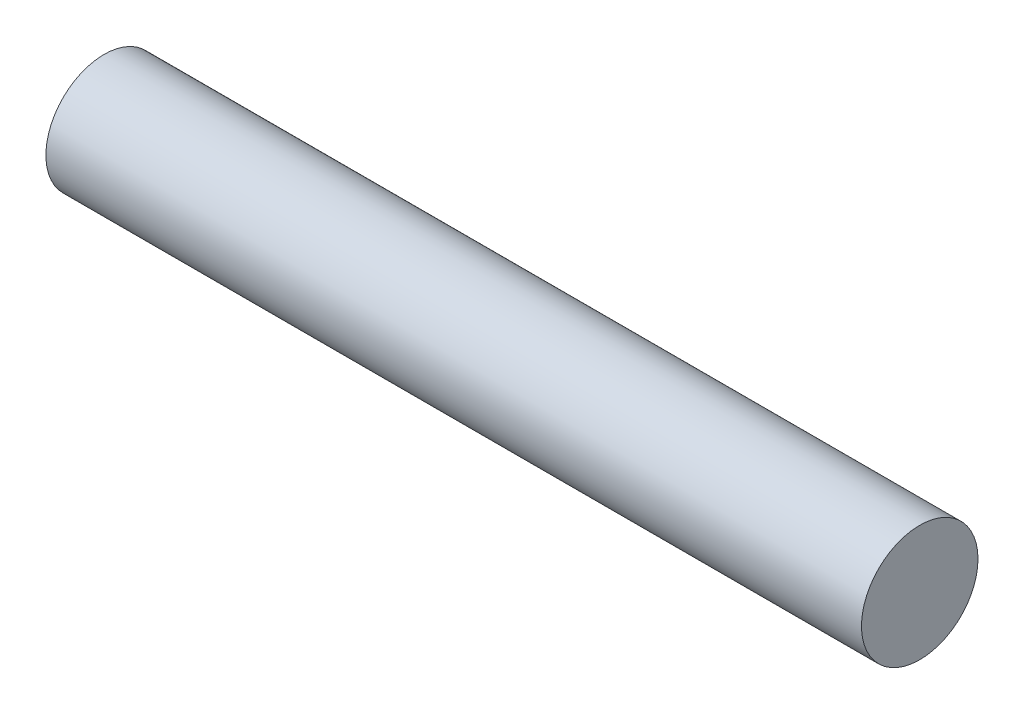
ISO-10303-21;
HEADER;
FILE_DESCRIPTION(('STEP AP214'),'2;1');
FILE_NAME('part.step','',(''),(''),'','','');
FILE_SCHEMA(('AUTOMOTIVE_DESIGN { 1 0 10303 214 1 1 1 1 }'));
ENDSEC;
DATA;
#1=APPLICATION_CONTEXT('core data for automotive mechanical design processes');
#2=APPLICATION_PROTOCOL_DEFINITION('international standard','automotive_design',2000,#1);
#3=PRODUCT_CONTEXT('',#1,'mechanical');
#4=PRODUCT('Part','Part','',(#3));
#5=PRODUCT_RELATED_PRODUCT_CATEGORY('part','',(#4));
#6=PRODUCT_DEFINITION_FORMATION('','',#4);
#7=PRODUCT_DEFINITION_CONTEXT('part definition',#1,'design');
#8=PRODUCT_DEFINITION('design','',#6,#7);
#9=PRODUCT_DEFINITION_SHAPE('','',#8);
#10=(LENGTH_UNIT() NAMED_UNIT(*) SI_UNIT(.MILLI.,.METRE.));
#11=(NAMED_UNIT(*) PLANE_ANGLE_UNIT() SI_UNIT($,.RADIAN.));
#12=(NAMED_UNIT(*) SI_UNIT($,.STERADIAN.) SOLID_ANGLE_UNIT());
#13=UNCERTAINTY_MEASURE_WITH_UNIT(LENGTH_MEASURE(1.E-05),#10,'distance_accuracy_value','');
#14=(GEOMETRIC_REPRESENTATION_CONTEXT(3) GLOBAL_UNCERTAINTY_ASSIGNED_CONTEXT((#13)) GLOBAL_UNIT_ASSIGNED_CONTEXT((#10,
#11,#12)) REPRESENTATION_CONTEXT('',''));
#15=CARTESIAN_POINT('',(0.,0.,0.));
#16=DIRECTION('',(0.,0.,1.));
#17=DIRECTION('',(1.,0.,0.));
#18=AXIS2_PLACEMENT_3D('',#15,#16,#17);
#19=CARTESIAN_POINT('',(14.,0.,0.));
#20=DIRECTION('',(-1.,0.,0.));
#21=DIRECTION('',(0.,0.,1.));
#22=AXIS2_PLACEMENT_3D('',#19,#20,#21);
#23=CYLINDRICAL_SURFACE('',#22,1.);
#24=CARTESIAN_POINT('',(14.,0.,0.));
#25=DIRECTION('',(1.,0.,0.));
#26=DIRECTION('',(0.,0.,-1.));
#27=AXIS2_PLACEMENT_3D('',#24,#25,#26);
#28=CIRCLE('',#27,1.);
#29=CARTESIAN_POINT('',(14.,0.,-1.));
#30=VERTEX_POINT('',#29);
#31=EDGE_CURVE('E10',#30,#30,#28,.T.);
#32=ORIENTED_EDGE('',*,*,#31,.F.);
#33=EDGE_LOOP('',(#32));
#34=FACE_BOUND('',#33,.T.);
#35=CARTESIAN_POINT('',(0.,0.,0.));
#36=DIRECTION('',(1.,0.,0.));
#37=DIRECTION('',(0.,0.,-1.));
#38=AXIS2_PLACEMENT_3D('',#35,#36,#37);
#39=CIRCLE('',#38,1.);
#40=CARTESIAN_POINT('',(0.,0.,-1.));
#41=VERTEX_POINT('',#40);
#42=EDGE_CURVE('E43',#41,#41,#39,.T.);
#43=ORIENTED_EDGE('',*,*,#42,.T.);
#44=EDGE_LOOP('',(#43));
#45=FACE_BOUND('',#44,.T.);
#46=ADVANCED_FACE('F40',(#34,#45),#23,.T.);
#47=CARTESIAN_POINT('',(14.,0.,0.));
#48=DIRECTION('',(1.,0.,0.));
#49=DIRECTION('',(0.,0.,-1.));
#50=AXIS2_PLACEMENT_3D('',#47,#48,#49);
#51=PLANE('',#50);
#52=ORIENTED_EDGE('',*,*,#31,.T.);
#53=EDGE_LOOP('',(#52));
#54=FACE_BOUND('',#53,.T.);
#55=ADVANCED_FACE('F57',(#54),#51,.T.);
#56=CARTESIAN_POINT('',(0.,0.,0.));
#57=DIRECTION('',(1.,0.,0.));
#58=DIRECTION('',(0.,0.,-1.));
#59=AXIS2_PLACEMENT_3D('',#56,#57,#58);
#60=PLANE('',#59);
#61=ORIENTED_EDGE('',*,*,#42,.F.);
#62=EDGE_LOOP('',(#61));
#63=FACE_BOUND('',#62,.T.);
#64=ADVANCED_FACE('F55',(#63),#60,.F.);
#65=CLOSED_SHELL('',(#46,#55,#64));
#66=MANIFOLD_SOLID_BREP('B2',#65);
#67=ADVANCED_BREP_SHAPE_REPRESENTATION('',(#18,#66),#14);
#68=SHAPE_DEFINITION_REPRESENTATION(#9,#67);
ENDSEC;
END-ISO-10303-21;
